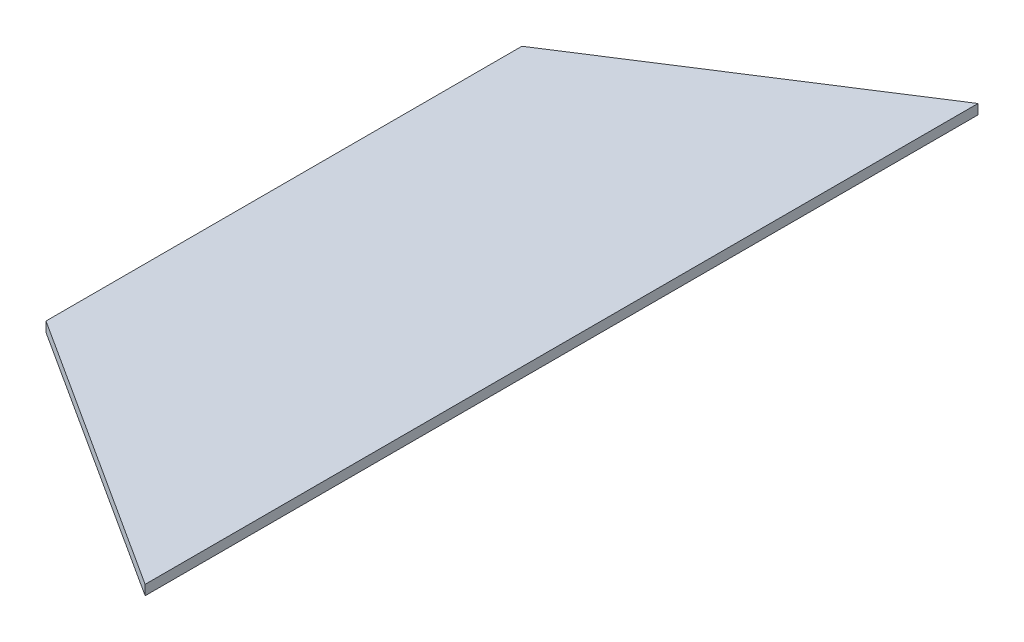
ISO-10303-21;
HEADER;
FILE_DESCRIPTION(('STEP AP214'),'2;1');
FILE_NAME('part.step','',(''),(''),'','','');
FILE_SCHEMA(('AUTOMOTIVE_DESIGN { 1 0 10303 214 1 1 1 1 }'));
ENDSEC;
DATA;
#1=APPLICATION_CONTEXT('core data for automotive mechanical design processes');
#2=APPLICATION_PROTOCOL_DEFINITION('international standard','automotive_design',2000,#1);
#3=PRODUCT_CONTEXT('',#1,'mechanical');
#4=PRODUCT('Part','Part','',(#3));
#5=PRODUCT_RELATED_PRODUCT_CATEGORY('part','',(#4));
#6=PRODUCT_DEFINITION_FORMATION('','',#4);
#7=PRODUCT_DEFINITION_CONTEXT('part definition',#1,'design');
#8=PRODUCT_DEFINITION('design','',#6,#7);
#9=PRODUCT_DEFINITION_SHAPE('','',#8);
#10=(LENGTH_UNIT() NAMED_UNIT(*) SI_UNIT(.MILLI.,.METRE.));
#11=(NAMED_UNIT(*) PLANE_ANGLE_UNIT() SI_UNIT($,.RADIAN.));
#12=(NAMED_UNIT(*) SI_UNIT($,.STERADIAN.) SOLID_ANGLE_UNIT());
#13=UNCERTAINTY_MEASURE_WITH_UNIT(LENGTH_MEASURE(1.E-05),#10,'distance_accuracy_value','');
#14=(GEOMETRIC_REPRESENTATION_CONTEXT(3) GLOBAL_UNCERTAINTY_ASSIGNED_CONTEXT((#13)) GLOBAL_UNIT_ASSIGNED_CONTEXT((#10,
#11,#12)) REPRESENTATION_CONTEXT('',''));
#15=CARTESIAN_POINT('',(0.,0.,0.));
#16=DIRECTION('',(0.,0.,1.));
#17=DIRECTION('',(1.,0.,0.));
#18=AXIS2_PLACEMENT_3D('',#15,#16,#17);
#19=CARTESIAN_POINT('',(-36.3915134934558,0.,-133.35));
#20=DIRECTION('',(0.,-1.,0.));
#21=DIRECTION('',(0.,0.,-1.));
#22=AXIS2_PLACEMENT_3D('',#19,#20,#21);
#23=PLANE('',#22);
#24=DIRECTION('',(0.,0.,1.));
#25=VECTOR('',#24,1.);
#26=CARTESIAN_POINT('',(-88.9,0.,-209.55));
#27=LINE('',#26,#25);
#28=CARTESIAN_POINT('',(-88.9,0.,-209.55));
#29=VERTEX_POINT('',#28);
#30=CARTESIAN_POINT('',(-88.9,0.,-57.15));
#31=VERTEX_POINT('',#30);
#32=EDGE_CURVE('E55',#29,#31,#27,.T.);
#33=ORIENTED_EDGE('',*,*,#32,.F.);
#34=DIRECTION('',(-0.841178475376554,0.,0.540757591313499));
#35=VECTOR('',#34,1.);
#36=CARTESIAN_POINT('',(0.,0.,-266.7));
#37=LINE('',#36,#35);
#38=CARTESIAN_POINT('',(0.,0.,-266.7));
#39=VERTEX_POINT('',#38);
#40=EDGE_CURVE('E57',#39,#29,#37,.T.);
#41=ORIENTED_EDGE('',*,*,#40,.F.);
#42=DIRECTION('',(0.,0.,-1.));
#43=VECTOR('',#42,1.);
#44=CARTESIAN_POINT('',(0.,0.,0.));
#45=LINE('',#44,#43);
#46=CARTESIAN_POINT('',(0.,0.,0.));
#47=VERTEX_POINT('',#46);
#48=EDGE_CURVE('E20',#47,#39,#45,.T.);
#49=ORIENTED_EDGE('',*,*,#48,.F.);
#50=DIRECTION('',(0.841178475376553,0.,0.540757591313499));
#51=VECTOR('',#50,1.);
#52=CARTESIAN_POINT('',(-88.9,0.,-57.15));
#53=LINE('',#52,#51);
#54=EDGE_CURVE('E79',#31,#47,#53,.T.);
#55=ORIENTED_EDGE('',*,*,#54,.F.);
#56=EDGE_LOOP('',(#33,#41,#49,#55));
#57=FACE_BOUND('',#56,.T.);
#58=ADVANCED_FACE('F17',(#57),#23,.T.);
#59=CARTESIAN_POINT('',(0.,0.,0.));
#60=DIRECTION('',(1.,0.,0.));
#61=DIRECTION('',(0.,0.,-1.));
#62=AXIS2_PLACEMENT_3D('',#59,#60,#61);
#63=PLANE('',#62);
#64=DIRECTION('',(0.,0.,1.));
#65=VECTOR('',#64,1.);
#66=CARTESIAN_POINT('',(0.,3.175,-133.35));
#67=LINE('',#66,#65);
#68=CARTESIAN_POINT('',(0.,3.175,0.));
#69=VERTEX_POINT('',#68);
#70=CARTESIAN_POINT('',(0.,3.175,-266.7));
#71=VERTEX_POINT('',#70);
#72=EDGE_CURVE('E83',#69,#71,#67,.F.);
#73=ORIENTED_EDGE('',*,*,#72,.F.);
#74=DIRECTION('',(0.,1.,0.));
#75=VECTOR('',#74,1.);
#76=CARTESIAN_POINT('',(0.,0.,0.));
#77=LINE('',#76,#75);
#78=EDGE_CURVE('E68',#47,#69,#77,.T.);
#79=ORIENTED_EDGE('',*,*,#78,.F.);
#80=ORIENTED_EDGE('',*,*,#48,.T.);
#81=DIRECTION('',(0.,1.,0.));
#82=VECTOR('',#81,1.);
#83=CARTESIAN_POINT('',(0.,0.,-266.7));
#84=LINE('',#83,#82);
#85=EDGE_CURVE('E63',#71,#39,#84,.F.);
#86=ORIENTED_EDGE('',*,*,#85,.F.);
#87=EDGE_LOOP('',(#73,#79,#80,#86));
#88=FACE_BOUND('',#87,.T.);
#89=ADVANCED_FACE('F65',(#88),#63,.T.);
#90=CARTESIAN_POINT('',(0.,0.,-266.7));
#91=DIRECTION('',(-0.540757591313499,0.,-0.841178475376554));
#92=DIRECTION('',(-0.841178475376554,0.,0.540757591313499));
#93=AXIS2_PLACEMENT_3D('',#90,#91,#92);
#94=PLANE('',#93);
#95=DIRECTION('',(-0.841178475376553,0.,0.540757591313499));
#96=VECTOR('',#95,1.);
#97=CARTESIAN_POINT('',(0.,3.175,-266.7));
#98=LINE('',#97,#96);
#99=CARTESIAN_POINT('',(-88.9,3.175,-209.55));
#100=VERTEX_POINT('',#99);
#101=EDGE_CURVE('E72',#71,#100,#98,.T.);
#102=ORIENTED_EDGE('',*,*,#101,.F.);
#103=ORIENTED_EDGE('',*,*,#85,.T.);
#104=ORIENTED_EDGE('',*,*,#40,.T.);
#105=DIRECTION('',(0.,1.,0.));
#106=VECTOR('',#105,1.);
#107=CARTESIAN_POINT('',(-88.9,0.,-209.55));
#108=LINE('',#107,#106);
#109=EDGE_CURVE('E75',#100,#29,#108,.F.);
#110=ORIENTED_EDGE('',*,*,#109,.F.);
#111=EDGE_LOOP('',(#102,#103,#104,#110));
#112=FACE_BOUND('',#111,.T.);
#113=ADVANCED_FACE('F70',(#112),#94,.T.);
#114=CARTESIAN_POINT('',(-88.9,0.,-209.55));
#115=DIRECTION('',(-1.,0.,0.));
#116=DIRECTION('',(0.,0.,1.));
#117=AXIS2_PLACEMENT_3D('',#114,#115,#116);
#118=PLANE('',#117);
#119=DIRECTION('',(0.,0.,1.));
#120=VECTOR('',#119,1.);
#121=CARTESIAN_POINT('',(-88.9,3.175,-133.35));
#122=LINE('',#121,#120);
#123=CARTESIAN_POINT('',(-88.9,3.175,-57.15));
#124=VERTEX_POINT('',#123);
#125=EDGE_CURVE('E26',#100,#124,#122,.T.);
#126=ORIENTED_EDGE('',*,*,#125,.F.);
#127=ORIENTED_EDGE('',*,*,#109,.T.);
#128=ORIENTED_EDGE('',*,*,#32,.T.);
#129=DIRECTION('',(0.,1.,0.));
#130=VECTOR('',#129,1.);
#131=CARTESIAN_POINT('',(-88.9,0.,-57.15));
#132=LINE('',#131,#130);
#133=EDGE_CURVE('E35',#124,#31,#132,.F.);
#134=ORIENTED_EDGE('',*,*,#133,.F.);
#135=EDGE_LOOP('',(#126,#127,#128,#134));
#136=FACE_BOUND('',#135,.T.);
#137=ADVANCED_FACE('F89',(#136),#118,.T.);
#138=CARTESIAN_POINT('',(-88.9,0.,-57.15));
#139=DIRECTION('',(-0.540757591313499,0.,0.841178475376553));
#140=DIRECTION('',(0.841178475376553,0.,0.540757591313499));
#141=AXIS2_PLACEMENT_3D('',#138,#139,#140);
#142=PLANE('',#141);
#143=DIRECTION('',(0.841178475376553,0.,0.540757591313499));
#144=VECTOR('',#143,1.);
#145=CARTESIAN_POINT('',(-88.9,3.175,-57.15));
#146=LINE('',#145,#144);
#147=EDGE_CURVE('E11',#124,#69,#146,.T.);
#148=ORIENTED_EDGE('',*,*,#147,.F.);
#149=ORIENTED_EDGE('',*,*,#133,.T.);
#150=ORIENTED_EDGE('',*,*,#54,.T.);
#151=ORIENTED_EDGE('',*,*,#78,.T.);
#152=EDGE_LOOP('',(#148,#149,#150,#151));
#153=FACE_BOUND('',#152,.T.);
#154=ADVANCED_FACE('F91',(#153),#142,.T.);
#155=CARTESIAN_POINT('',(-36.3915134934558,3.175,-133.35));
#156=DIRECTION('',(0.,1.,0.));
#157=DIRECTION('',(0.,0.,1.));
#158=AXIS2_PLACEMENT_3D('',#155,#156,#157);
#159=PLANE('',#158);
#160=ORIENTED_EDGE('',*,*,#125,.T.);
#161=ORIENTED_EDGE('',*,*,#147,.T.);
#162=ORIENTED_EDGE('',*,*,#72,.T.);
#163=ORIENTED_EDGE('',*,*,#101,.T.);
#164=EDGE_LOOP('',(#160,#161,#162,#163));
#165=FACE_BOUND('',#164,.T.);
#166=ADVANCED_FACE('F88',(#165),#159,.T.);
#167=CLOSED_SHELL('',(#58,#89,#113,#137,#154,#166));
#168=MANIFOLD_SOLID_BREP('B1',#167);
#169=ADVANCED_BREP_SHAPE_REPRESENTATION('',(#18,#168),#14);
#170=SHAPE_DEFINITION_REPRESENTATION(#9,#169);
ENDSEC;
END-ISO-10303-21;
